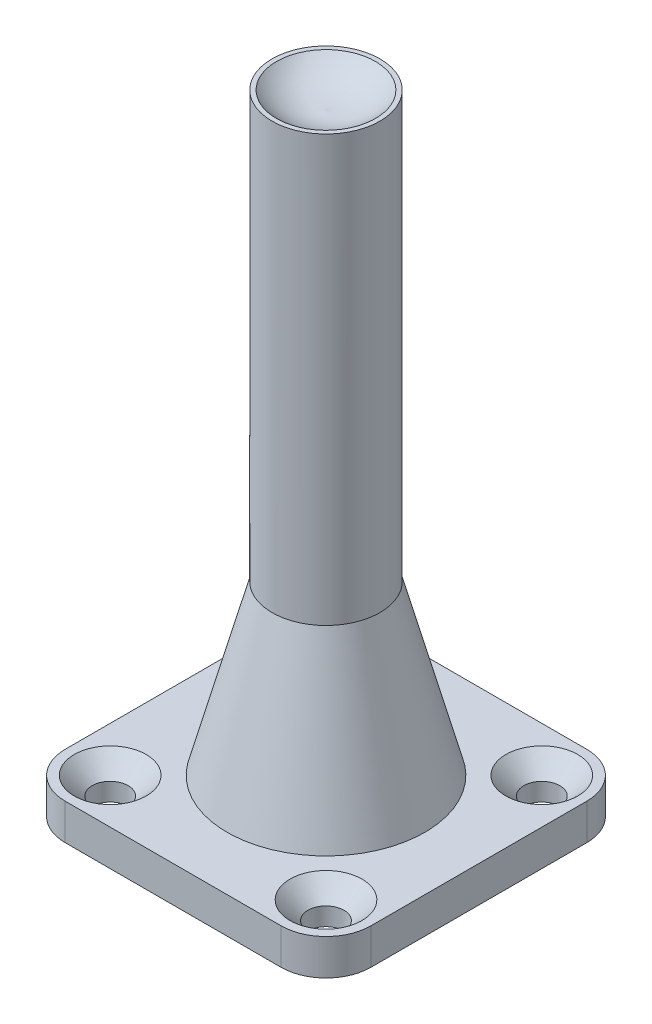
ISO-10303-21;
HEADER;
FILE_DESCRIPTION(('STEP AP214'),'2;1');
FILE_NAME('part.step','',(''),(''),'','','');
FILE_SCHEMA(('AUTOMOTIVE_DESIGN { 1 0 10303 214 1 1 1 1 }'));
ENDSEC;
DATA;
#1=APPLICATION_CONTEXT('core data for automotive mechanical design processes');
#2=APPLICATION_PROTOCOL_DEFINITION('international standard','automotive_design',2000,#1);
#3=PRODUCT_CONTEXT('',#1,'mechanical');
#4=PRODUCT('Part','Part','',(#3));
#5=PRODUCT_RELATED_PRODUCT_CATEGORY('part','',(#4));
#6=PRODUCT_DEFINITION_FORMATION('','',#4);
#7=PRODUCT_DEFINITION_CONTEXT('part definition',#1,'design');
#8=PRODUCT_DEFINITION('design','',#6,#7);
#9=PRODUCT_DEFINITION_SHAPE('','',#8);
#10=(LENGTH_UNIT() NAMED_UNIT(*) SI_UNIT(.MILLI.,.METRE.));
#11=(NAMED_UNIT(*) PLANE_ANGLE_UNIT() SI_UNIT($,.RADIAN.));
#12=(NAMED_UNIT(*) SI_UNIT($,.STERADIAN.) SOLID_ANGLE_UNIT());
#13=UNCERTAINTY_MEASURE_WITH_UNIT(LENGTH_MEASURE(1.E-05),#10,'distance_accuracy_value','');
#14=(GEOMETRIC_REPRESENTATION_CONTEXT(3) GLOBAL_UNCERTAINTY_ASSIGNED_CONTEXT((#13)) GLOBAL_UNIT_ASSIGNED_CONTEXT((#10,
#11,#12)) REPRESENTATION_CONTEXT('',''));
#15=CARTESIAN_POINT('',(0.,0.,0.));
#16=DIRECTION('',(0.,0.,1.));
#17=DIRECTION('',(1.,0.,0.));
#18=AXIS2_PLACEMENT_3D('',#15,#16,#17);
#19=CARTESIAN_POINT('',(0.,4.,0.));
#20=DIRECTION('',(0.,-1.,0.));
#21=DIRECTION('',(0.,0.,-1.));
#22=AXIS2_PLACEMENT_3D('',#19,#20,#21);
#23=PLANE('',#22);
#24=CARTESIAN_POINT('',(-12.,4.,12.));
#25=DIRECTION('',(0.,-1.,0.));
#26=DIRECTION('',(0.,0.,-1.));
#27=AXIS2_PLACEMENT_3D('',#24,#25,#26);
#28=CIRCLE('',#27,4.);
#29=CARTESIAN_POINT('',(-12.,4.,8.));
#30=VERTEX_POINT('',#29);
#31=EDGE_CURVE('E206',#30,#30,#28,.T.);
#32=ORIENTED_EDGE('',*,*,#31,.T.);
#33=EDGE_LOOP('',(#32));
#34=FACE_BOUND('',#33,.T.);
#35=CARTESIAN_POINT('',(12.,4.,12.));
#36=DIRECTION('',(0.,-1.,0.));
#37=DIRECTION('',(0.,0.,-1.));
#38=AXIS2_PLACEMENT_3D('',#35,#36,#37);
#39=CIRCLE('',#38,4.);
#40=CARTESIAN_POINT('',(12.,4.,8.));
#41=VERTEX_POINT('',#40);
#42=EDGE_CURVE('E203',#41,#41,#39,.T.);
#43=ORIENTED_EDGE('',*,*,#42,.T.);
#44=EDGE_LOOP('',(#43));
#45=FACE_BOUND('',#44,.T.);
#46=CARTESIAN_POINT('',(-12.,4.,-12.));
#47=DIRECTION('',(0.,-1.,0.));
#48=DIRECTION('',(0.,0.,-1.));
#49=AXIS2_PLACEMENT_3D('',#46,#47,#48);
#50=CIRCLE('',#49,4.);
#51=CARTESIAN_POINT('',(-12.,4.,-16.));
#52=VERTEX_POINT('',#51);
#53=EDGE_CURVE('E200',#52,#52,#50,.T.);
#54=ORIENTED_EDGE('',*,*,#53,.T.);
#55=EDGE_LOOP('',(#54));
#56=FACE_BOUND('',#55,.T.);
#57=CARTESIAN_POINT('',(12.,4.,-12.));
#58=DIRECTION('',(0.,-1.,0.));
#59=DIRECTION('',(0.,0.,-1.));
#60=AXIS2_PLACEMENT_3D('',#57,#58,#59);
#61=CIRCLE('',#60,4.);
#62=CARTESIAN_POINT('',(12.,4.,-16.));
#63=VERTEX_POINT('',#62);
#64=EDGE_CURVE('E197',#63,#63,#61,.T.);
#65=ORIENTED_EDGE('',*,*,#64,.T.);
#66=EDGE_LOOP('',(#65));
#67=FACE_BOUND('',#66,.T.);
#68=CARTESIAN_POINT('',(0.,4.,0.));
#69=DIRECTION('',(0.,-1.,0.));
#70=DIRECTION('',(0.,0.,-1.));
#71=AXIS2_PLACEMENT_3D('',#68,#69,#70);
#72=CIRCLE('',#71,11.);
#73=CARTESIAN_POINT('',(0.,4.,-11.));
#74=VERTEX_POINT('',#73);
#75=EDGE_CURVE('E191',#74,#74,#72,.T.);
#76=ORIENTED_EDGE('',*,*,#75,.T.);
#77=EDGE_LOOP('',(#76));
#78=FACE_BOUND('',#77,.T.);
#79=DIRECTION('',(1.,0.,0.));
#80=VECTOR('',#79,1.);
#81=CARTESIAN_POINT('',(-17.,4.,17.));
#82=LINE('',#81,#80);
#83=CARTESIAN_POINT('',(-12.,4.,17.));
#84=VERTEX_POINT('',#83);
#85=CARTESIAN_POINT('',(12.,4.,17.));
#86=VERTEX_POINT('',#85);
#87=EDGE_CURVE('E142',#84,#86,#82,.T.);
#88=ORIENTED_EDGE('',*,*,#87,.T.);
#89=CARTESIAN_POINT('',(12.,4.,12.));
#90=DIRECTION('',(0.,-1.,0.));
#91=DIRECTION('',(0.,0.,-1.));
#92=AXIS2_PLACEMENT_3D('',#89,#90,#91);
#93=CIRCLE('',#92,5.);
#94=CARTESIAN_POINT('',(17.,4.,12.));
#95=VERTEX_POINT('',#94);
#96=EDGE_CURVE('E177',#86,#95,#93,.F.);
#97=ORIENTED_EDGE('',*,*,#96,.T.);
#98=DIRECTION('',(0.,0.,-1.));
#99=VECTOR('',#98,1.);
#100=CARTESIAN_POINT('',(17.,4.,17.));
#101=LINE('',#100,#99);
#102=CARTESIAN_POINT('',(17.,4.,-12.));
#103=VERTEX_POINT('',#102);
#104=EDGE_CURVE('E134',#95,#103,#101,.T.);
#105=ORIENTED_EDGE('',*,*,#104,.T.);
#106=CARTESIAN_POINT('',(12.,4.,-12.));
#107=DIRECTION('',(0.,-1.,0.));
#108=DIRECTION('',(0.,0.,-1.));
#109=AXIS2_PLACEMENT_3D('',#106,#107,#108);
#110=CIRCLE('',#109,5.);
#111=CARTESIAN_POINT('',(12.,4.,-17.));
#112=VERTEX_POINT('',#111);
#113=EDGE_CURVE('E174',#103,#112,#110,.F.);
#114=ORIENTED_EDGE('',*,*,#113,.T.);
#115=DIRECTION('',(-1.,0.,0.));
#116=VECTOR('',#115,1.);
#117=CARTESIAN_POINT('',(-17.,4.,-17.));
#118=LINE('',#117,#116);
#119=CARTESIAN_POINT('',(-12.,4.,-17.));
#120=VERTEX_POINT('',#119);
#121=EDGE_CURVE('E137',#112,#120,#118,.T.);
#122=ORIENTED_EDGE('',*,*,#121,.T.);
#123=CARTESIAN_POINT('',(-12.,4.,-12.));
#124=DIRECTION('',(0.,-1.,0.));
#125=DIRECTION('',(0.,0.,-1.));
#126=AXIS2_PLACEMENT_3D('',#123,#124,#125);
#127=CIRCLE('',#126,5.);
#128=CARTESIAN_POINT('',(-17.,4.,-12.));
#129=VERTEX_POINT('',#128);
#130=EDGE_CURVE('E60',#120,#129,#127,.F.);
#131=ORIENTED_EDGE('',*,*,#130,.T.);
#132=DIRECTION('',(0.,0.,1.));
#133=VECTOR('',#132,1.);
#134=CARTESIAN_POINT('',(-17.,4.,17.));
#135=LINE('',#134,#133);
#136=CARTESIAN_POINT('',(-17.,4.,12.));
#137=VERTEX_POINT('',#136);
#138=EDGE_CURVE('E140',#129,#137,#135,.T.);
#139=ORIENTED_EDGE('',*,*,#138,.T.);
#140=CARTESIAN_POINT('',(-12.,4.,12.));
#141=DIRECTION('',(0.,-1.,0.));
#142=DIRECTION('',(0.,0.,-1.));
#143=AXIS2_PLACEMENT_3D('',#140,#141,#142);
#144=CIRCLE('',#143,5.);
#145=EDGE_CURVE('E172',#137,#84,#144,.F.);
#146=ORIENTED_EDGE('',*,*,#145,.T.);
#147=EDGE_LOOP('',(#88,#97,#105,#114,#122,#131,#139,#146));
#148=FACE_BOUND('',#147,.T.);
#149=ADVANCED_FACE('F37',(#34,#45,#56,#67,#78,#148),#23,.F.);
#150=CARTESIAN_POINT('',(0.,0.,0.));
#151=DIRECTION('',(0.,-1.,0.));
#152=DIRECTION('',(0.,0.,-1.));
#153=AXIS2_PLACEMENT_3D('',#150,#151,#152);
#154=PLANE('',#153);
#155=CARTESIAN_POINT('',(12.,0.,12.));
#156=DIRECTION('',(0.,1.,0.));
#157=DIRECTION('',(0.,0.,1.));
#158=AXIS2_PLACEMENT_3D('',#155,#156,#157);
#159=CIRCLE('',#158,2.);
#160=CARTESIAN_POINT('',(12.,0.,14.));
#161=VERTEX_POINT('',#160);
#162=EDGE_CURVE('E124',#161,#161,#159,.T.);
#163=ORIENTED_EDGE('',*,*,#162,.T.);
#164=EDGE_LOOP('',(#163));
#165=FACE_BOUND('',#164,.T.);
#166=CARTESIAN_POINT('',(-12.,0.,-12.));
#167=DIRECTION('',(0.,1.,0.));
#168=DIRECTION('',(0.,0.,1.));
#169=AXIS2_PLACEMENT_3D('',#166,#167,#168);
#170=CIRCLE('',#169,2.);
#171=CARTESIAN_POINT('',(-12.,0.,-10.));
#172=VERTEX_POINT('',#171);
#173=EDGE_CURVE('E130',#172,#172,#170,.T.);
#174=ORIENTED_EDGE('',*,*,#173,.T.);
#175=EDGE_LOOP('',(#174));
#176=FACE_BOUND('',#175,.T.);
#177=DIRECTION('',(0.,0.,-1.));
#178=VECTOR('',#177,1.);
#179=CARTESIAN_POINT('',(17.,0.,17.));
#180=LINE('',#179,#178);
#181=CARTESIAN_POINT('',(17.,0.,12.));
#182=VERTEX_POINT('',#181);
#183=CARTESIAN_POINT('',(17.,0.,-12.));
#184=VERTEX_POINT('',#183);
#185=EDGE_CURVE('E133',#182,#184,#180,.T.);
#186=ORIENTED_EDGE('',*,*,#185,.F.);
#187=CARTESIAN_POINT('',(12.,0.,12.));
#188=DIRECTION('',(0.,-1.,0.));
#189=DIRECTION('',(0.,0.,-1.));
#190=AXIS2_PLACEMENT_3D('',#187,#188,#189);
#191=CIRCLE('',#190,5.);
#192=CARTESIAN_POINT('',(12.,0.,17.));
#193=VERTEX_POINT('',#192);
#194=EDGE_CURVE('E165',#182,#193,#191,.T.);
#195=ORIENTED_EDGE('',*,*,#194,.T.);
#196=DIRECTION('',(1.,0.,0.));
#197=VECTOR('',#196,1.);
#198=CARTESIAN_POINT('',(-17.,0.,17.));
#199=LINE('',#198,#197);
#200=CARTESIAN_POINT('',(-12.,0.,17.));
#201=VERTEX_POINT('',#200);
#202=EDGE_CURVE('E138',#201,#193,#199,.T.);
#203=ORIENTED_EDGE('',*,*,#202,.F.);
#204=CARTESIAN_POINT('',(-12.,0.,12.));
#205=DIRECTION('',(0.,-1.,0.));
#206=DIRECTION('',(0.,0.,-1.));
#207=AXIS2_PLACEMENT_3D('',#204,#205,#206);
#208=CIRCLE('',#207,5.);
#209=CARTESIAN_POINT('',(-17.,0.,12.));
#210=VERTEX_POINT('',#209);
#211=EDGE_CURVE('E159',#201,#210,#208,.T.);
#212=ORIENTED_EDGE('',*,*,#211,.T.);
#213=DIRECTION('',(0.,0.,1.));
#214=VECTOR('',#213,1.);
#215=CARTESIAN_POINT('',(-17.,0.,17.));
#216=LINE('',#215,#214);
#217=CARTESIAN_POINT('',(-17.,0.,-12.));
#218=VERTEX_POINT('',#217);
#219=EDGE_CURVE('E151',#218,#210,#216,.T.);
#220=ORIENTED_EDGE('',*,*,#219,.F.);
#221=CARTESIAN_POINT('',(-12.,0.,-12.));
#222=DIRECTION('',(0.,-1.,0.));
#223=DIRECTION('',(0.,0.,-1.));
#224=AXIS2_PLACEMENT_3D('',#221,#222,#223);
#225=CIRCLE('',#224,5.);
#226=CARTESIAN_POINT('',(-12.,0.,-17.));
#227=VERTEX_POINT('',#226);
#228=EDGE_CURVE('E163',#218,#227,#225,.T.);
#229=ORIENTED_EDGE('',*,*,#228,.T.);
#230=DIRECTION('',(-1.,0.,0.));
#231=VECTOR('',#230,1.);
#232=CARTESIAN_POINT('',(-17.,0.,-17.));
#233=LINE('',#232,#231);
#234=CARTESIAN_POINT('',(12.,0.,-17.));
#235=VERTEX_POINT('',#234);
#236=EDGE_CURVE('E148',#235,#227,#233,.T.);
#237=ORIENTED_EDGE('',*,*,#236,.F.);
#238=CARTESIAN_POINT('',(12.,0.,-12.));
#239=DIRECTION('',(0.,-1.,0.));
#240=DIRECTION('',(0.,0.,-1.));
#241=AXIS2_PLACEMENT_3D('',#238,#239,#240);
#242=CIRCLE('',#241,5.);
#243=EDGE_CURVE('E161',#235,#184,#242,.T.);
#244=ORIENTED_EDGE('',*,*,#243,.T.);
#245=EDGE_LOOP('',(#186,#195,#203,#212,#220,#229,#237,#244));
#246=FACE_BOUND('',#245,.T.);
#247=CARTESIAN_POINT('',(12.,0.,-12.));
#248=DIRECTION('',(0.,1.,0.));
#249=DIRECTION('',(0.,0.,1.));
#250=AXIS2_PLACEMENT_3D('',#247,#248,#249);
#251=CIRCLE('',#250,2.);
#252=CARTESIAN_POINT('',(12.,0.,-10.));
#253=VERTEX_POINT('',#252);
#254=EDGE_CURVE('E127',#253,#253,#251,.T.);
#255=ORIENTED_EDGE('',*,*,#254,.T.);
#256=EDGE_LOOP('',(#255));
#257=FACE_BOUND('',#256,.T.);
#258=CARTESIAN_POINT('',(-12.,0.,12.));
#259=DIRECTION('',(0.,1.,0.));
#260=DIRECTION('',(0.,0.,1.));
#261=AXIS2_PLACEMENT_3D('',#258,#259,#260);
#262=CIRCLE('',#261,2.);
#263=CARTESIAN_POINT('',(-12.,0.,14.));
#264=VERTEX_POINT('',#263);
#265=EDGE_CURVE('E119',#264,#264,#262,.T.);
#266=ORIENTED_EDGE('',*,*,#265,.T.);
#267=EDGE_LOOP('',(#266));
#268=FACE_BOUND('',#267,.T.);
#269=ADVANCED_FACE('F232',(#165,#176,#246,#257,#268),#154,.T.);
#270=CARTESIAN_POINT('',(17.,4.,17.));
#271=DIRECTION('',(-1.,0.,0.));
#272=DIRECTION('',(0.,0.,1.));
#273=AXIS2_PLACEMENT_3D('',#270,#271,#272);
#274=PLANE('',#273);
#275=ORIENTED_EDGE('',*,*,#104,.F.);
#276=DIRECTION('',(0.,-1.,0.));
#277=VECTOR('',#276,1.);
#278=CARTESIAN_POINT('',(17.,4.,12.));
#279=LINE('',#278,#277);
#280=EDGE_CURVE('E156',#95,#182,#279,.T.);
#281=ORIENTED_EDGE('',*,*,#280,.T.);
#282=ORIENTED_EDGE('',*,*,#185,.T.);
#283=DIRECTION('',(0.,-1.,0.));
#284=VECTOR('',#283,1.);
#285=CARTESIAN_POINT('',(17.,4.,-12.));
#286=LINE('',#285,#284);
#287=EDGE_CURVE('E145',#184,#103,#286,.F.);
#288=ORIENTED_EDGE('',*,*,#287,.T.);
#289=EDGE_LOOP('',(#275,#281,#282,#288));
#290=FACE_BOUND('',#289,.T.);
#291=ADVANCED_FACE('F238',(#290),#274,.F.);
#292=CARTESIAN_POINT('',(-17.,4.,-17.));
#293=DIRECTION('',(0.,0.,1.));
#294=DIRECTION('',(1.,0.,0.));
#295=AXIS2_PLACEMENT_3D('',#292,#293,#294);
#296=PLANE('',#295);
#297=ORIENTED_EDGE('',*,*,#236,.T.);
#298=DIRECTION('',(0.,-1.,0.));
#299=VECTOR('',#298,1.);
#300=CARTESIAN_POINT('',(-12.,4.,-17.));
#301=LINE('',#300,#299);
#302=EDGE_CURVE('E186',#227,#120,#301,.F.);
#303=ORIENTED_EDGE('',*,*,#302,.T.);
#304=ORIENTED_EDGE('',*,*,#121,.F.);
#305=DIRECTION('',(0.,-1.,0.));
#306=VECTOR('',#305,1.);
#307=CARTESIAN_POINT('',(12.,4.,-17.));
#308=LINE('',#307,#306);
#309=EDGE_CURVE('E183',#112,#235,#308,.T.);
#310=ORIENTED_EDGE('',*,*,#309,.T.);
#311=EDGE_LOOP('',(#297,#303,#304,#310));
#312=FACE_BOUND('',#311,.T.);
#313=ADVANCED_FACE('F252',(#312),#296,.F.);
#314=CARTESIAN_POINT('',(-17.,4.,17.));
#315=DIRECTION('',(1.,0.,0.));
#316=DIRECTION('',(0.,0.,-1.));
#317=AXIS2_PLACEMENT_3D('',#314,#315,#316);
#318=PLANE('',#317);
#319=ORIENTED_EDGE('',*,*,#138,.F.);
#320=DIRECTION('',(0.,-1.,0.));
#321=VECTOR('',#320,1.);
#322=CARTESIAN_POINT('',(-17.,4.,-12.));
#323=LINE('',#322,#321);
#324=EDGE_CURVE('E180',#129,#218,#323,.T.);
#325=ORIENTED_EDGE('',*,*,#324,.T.);
#326=ORIENTED_EDGE('',*,*,#219,.T.);
#327=DIRECTION('',(0.,-1.,0.));
#328=VECTOR('',#327,1.);
#329=CARTESIAN_POINT('',(-17.,4.,12.));
#330=LINE('',#329,#328);
#331=EDGE_CURVE('E53',#210,#137,#330,.F.);
#332=ORIENTED_EDGE('',*,*,#331,.T.);
#333=EDGE_LOOP('',(#319,#325,#326,#332));
#334=FACE_BOUND('',#333,.T.);
#335=ADVANCED_FACE('F248',(#334),#318,.F.);
#336=CARTESIAN_POINT('',(-17.,4.,17.));
#337=DIRECTION('',(0.,0.,-1.));
#338=DIRECTION('',(-1.,0.,0.));
#339=AXIS2_PLACEMENT_3D('',#336,#337,#338);
#340=PLANE('',#339);
#341=ORIENTED_EDGE('',*,*,#202,.T.);
#342=DIRECTION('',(0.,-1.,0.));
#343=VECTOR('',#342,1.);
#344=CARTESIAN_POINT('',(12.,4.,17.));
#345=LINE('',#344,#343);
#346=EDGE_CURVE('E170',#193,#86,#345,.F.);
#347=ORIENTED_EDGE('',*,*,#346,.T.);
#348=ORIENTED_EDGE('',*,*,#87,.F.);
#349=DIRECTION('',(0.,-1.,0.));
#350=VECTOR('',#349,1.);
#351=CARTESIAN_POINT('',(-12.,4.,17.));
#352=LINE('',#351,#350);
#353=EDGE_CURVE('E167',#84,#201,#352,.T.);
#354=ORIENTED_EDGE('',*,*,#353,.T.);
#355=EDGE_LOOP('',(#341,#347,#348,#354));
#356=FACE_BOUND('',#355,.T.);
#357=ADVANCED_FACE('F245',(#356),#340,.F.);
#358=CARTESIAN_POINT('',(-12.,4.,-12.));
#359=DIRECTION('',(0.,-1.,0.));
#360=DIRECTION('',(0.,0.,-1.));
#361=AXIS2_PLACEMENT_3D('',#358,#359,#360);
#362=CYLINDRICAL_SURFACE('',#361,2.);
#363=CARTESIAN_POINT('',(-12.,2.00000000000001,-12.));
#364=DIRECTION('',(0.,-1.,0.));
#365=DIRECTION('',(0.,0.,-1.));
#366=AXIS2_PLACEMENT_3D('',#363,#364,#365);
#367=CIRCLE('',#366,2.);
#368=CARTESIAN_POINT('',(-12.,2.00000000000001,-14.));
#369=VERTEX_POINT('',#368);
#370=EDGE_CURVE('E46',#369,#369,#367,.F.);
#371=ORIENTED_EDGE('',*,*,#370,.T.);
#372=EDGE_LOOP('',(#371));
#373=FACE_BOUND('',#372,.T.);
#374=ORIENTED_EDGE('',*,*,#173,.F.);
#375=EDGE_LOOP('',(#374));
#376=FACE_BOUND('',#375,.T.);
#377=ADVANCED_FACE('F214',(#373,#376),#362,.F.);
#378=CARTESIAN_POINT('',(12.,4.,-12.));
#379=DIRECTION('',(0.,-1.,0.));
#380=DIRECTION('',(0.,0.,-1.));
#381=AXIS2_PLACEMENT_3D('',#378,#379,#380);
#382=CYLINDRICAL_SURFACE('',#381,2.);
#383=CARTESIAN_POINT('',(12.,2.00000000000001,-12.));
#384=DIRECTION('',(0.,-1.,0.));
#385=DIRECTION('',(0.,0.,-1.));
#386=AXIS2_PLACEMENT_3D('',#383,#384,#385);
#387=CIRCLE('',#386,2.);
#388=CARTESIAN_POINT('',(12.,2.00000000000001,-14.));
#389=VERTEX_POINT('',#388);
#390=EDGE_CURVE('E11',#389,#389,#387,.F.);
#391=ORIENTED_EDGE('',*,*,#390,.T.);
#392=EDGE_LOOP('',(#391));
#393=FACE_BOUND('',#392,.T.);
#394=ORIENTED_EDGE('',*,*,#254,.F.);
#395=EDGE_LOOP('',(#394));
#396=FACE_BOUND('',#395,.T.);
#397=ADVANCED_FACE('F310',(#393,#396),#382,.F.);
#398=CARTESIAN_POINT('',(12.,4.,12.));
#399=DIRECTION('',(0.,-1.,0.));
#400=DIRECTION('',(0.,0.,-1.));
#401=AXIS2_PLACEMENT_3D('',#398,#399,#400);
#402=CYLINDRICAL_SURFACE('',#401,2.);
#403=CARTESIAN_POINT('',(12.,2.00000000000001,12.));
#404=DIRECTION('',(0.,-1.,0.));
#405=DIRECTION('',(0.,0.,-1.));
#406=AXIS2_PLACEMENT_3D('',#403,#404,#405);
#407=CIRCLE('',#406,2.);
#408=CARTESIAN_POINT('',(12.,2.00000000000001,10.));
#409=VERTEX_POINT('',#408);
#410=EDGE_CURVE('E209',#409,#409,#407,.F.);
#411=ORIENTED_EDGE('',*,*,#410,.T.);
#412=EDGE_LOOP('',(#411));
#413=FACE_BOUND('',#412,.T.);
#414=ORIENTED_EDGE('',*,*,#162,.F.);
#415=EDGE_LOOP('',(#414));
#416=FACE_BOUND('',#415,.T.);
#417=ADVANCED_FACE('F303',(#413,#416),#402,.F.);
#418=CARTESIAN_POINT('',(-12.,4.,12.));
#419=DIRECTION('',(0.,-1.,0.));
#420=DIRECTION('',(0.,0.,-1.));
#421=AXIS2_PLACEMENT_3D('',#418,#419,#420);
#422=CYLINDRICAL_SURFACE('',#421,2.);
#423=CARTESIAN_POINT('',(-12.,2.00000000000001,12.));
#424=DIRECTION('',(0.,-1.,0.));
#425=DIRECTION('',(0.,0.,-1.));
#426=AXIS2_PLACEMENT_3D('',#423,#424,#425);
#427=CIRCLE('',#426,2.);
#428=CARTESIAN_POINT('',(-12.,2.00000000000001,10.));
#429=VERTEX_POINT('',#428);
#430=EDGE_CURVE('E194',#429,#429,#427,.F.);
#431=ORIENTED_EDGE('',*,*,#430,.T.);
#432=EDGE_LOOP('',(#431));
#433=FACE_BOUND('',#432,.T.);
#434=ORIENTED_EDGE('',*,*,#265,.F.);
#435=EDGE_LOOP('',(#434));
#436=FACE_BOUND('',#435,.T.);
#437=ADVANCED_FACE('F263',(#433,#436),#422,.F.);
#438=CARTESIAN_POINT('',(12.,4.,12.));
#439=DIRECTION('',(0.,-1.,0.));
#440=DIRECTION('',(0.,0.,-1.));
#441=AXIS2_PLACEMENT_3D('',#438,#439,#440);
#442=CYLINDRICAL_SURFACE('',#441,5.);
#443=ORIENTED_EDGE('',*,*,#96,.F.);
#444=ORIENTED_EDGE('',*,*,#346,.F.);
#445=ORIENTED_EDGE('',*,*,#194,.F.);
#446=ORIENTED_EDGE('',*,*,#280,.F.);
#447=EDGE_LOOP('',(#443,#444,#445,#446));
#448=FACE_BOUND('',#447,.T.);
#449=ADVANCED_FACE('F259',(#448),#442,.T.);
#450=CARTESIAN_POINT('',(-12.,4.,-12.));
#451=DIRECTION('',(0.,-1.,0.));
#452=DIRECTION('',(0.,0.,-1.));
#453=AXIS2_PLACEMENT_3D('',#450,#451,#452);
#454=CYLINDRICAL_SURFACE('',#453,5.);
#455=ORIENTED_EDGE('',*,*,#130,.F.);
#456=ORIENTED_EDGE('',*,*,#302,.F.);
#457=ORIENTED_EDGE('',*,*,#228,.F.);
#458=ORIENTED_EDGE('',*,*,#324,.F.);
#459=EDGE_LOOP('',(#455,#456,#457,#458));
#460=FACE_BOUND('',#459,.T.);
#461=ADVANCED_FACE('F262',(#460),#454,.T.);
#462=CARTESIAN_POINT('',(12.,4.,-12.));
#463=DIRECTION('',(0.,-1.,0.));
#464=DIRECTION('',(0.,0.,-1.));
#465=AXIS2_PLACEMENT_3D('',#462,#463,#464);
#466=CYLINDRICAL_SURFACE('',#465,5.);
#467=ORIENTED_EDGE('',*,*,#113,.F.);
#468=ORIENTED_EDGE('',*,*,#287,.F.);
#469=ORIENTED_EDGE('',*,*,#243,.F.);
#470=ORIENTED_EDGE('',*,*,#309,.F.);
#471=EDGE_LOOP('',(#467,#468,#469,#470));
#472=FACE_BOUND('',#471,.T.);
#473=ADVANCED_FACE('F267',(#472),#466,.T.);
#474=CARTESIAN_POINT('',(-12.,4.,12.));
#475=DIRECTION('',(0.,-1.,0.));
#476=DIRECTION('',(0.,0.,-1.));
#477=AXIS2_PLACEMENT_3D('',#474,#475,#476);
#478=CYLINDRICAL_SURFACE('',#477,5.);
#479=ORIENTED_EDGE('',*,*,#145,.F.);
#480=ORIENTED_EDGE('',*,*,#331,.F.);
#481=ORIENTED_EDGE('',*,*,#211,.F.);
#482=ORIENTED_EDGE('',*,*,#353,.F.);
#483=EDGE_LOOP('',(#479,#480,#481,#482));
#484=FACE_BOUND('',#483,.T.);
#485=ADVANCED_FACE('F271',(#484),#478,.T.);
#486=CARTESIAN_POINT('',(0.,70.,0.));
#487=DIRECTION('',(0.,-1.,0.));
#488=DIRECTION('',(0.,0.,-1.));
#489=AXIS2_PLACEMENT_3D('',#486,#487,#488);
#490=CYLINDRICAL_SURFACE('',#489,6.);
#491=CARTESIAN_POINT('',(0.,22.660254037845,0.));
#492=DIRECTION('',(0.,-1.,0.));
#493=DIRECTION('',(0.,0.,-1.));
#494=AXIS2_PLACEMENT_3D('',#491,#492,#493);
#495=CIRCLE('',#494,6.);
#496=CARTESIAN_POINT('',(0.,22.660254037845,-6.));
#497=VERTEX_POINT('',#496);
#498=EDGE_CURVE('E188',#497,#497,#495,.F.);
#499=ORIENTED_EDGE('',*,*,#498,.T.);
#500=EDGE_LOOP('',(#499));
#501=FACE_BOUND('',#500,.T.);
#502=CARTESIAN_POINT('',(0.,70.,0.));
#503=DIRECTION('',(0.,1.,0.));
#504=DIRECTION('',(0.,0.,1.));
#505=AXIS2_PLACEMENT_3D('',#502,#503,#504);
#506=CIRCLE('',#505,6.);
#507=CARTESIAN_POINT('',(0.,70.,6.));
#508=VERTEX_POINT('',#507);
#509=EDGE_CURVE('E116',#508,#508,#506,.T.);
#510=ORIENTED_EDGE('',*,*,#509,.F.);
#511=EDGE_LOOP('',(#510));
#512=FACE_BOUND('',#511,.T.);
#513=ADVANCED_FACE('F275',(#501,#512),#490,.T.);
#514=CARTESIAN_POINT('',(0.,70.,0.));
#515=DIRECTION('',(0.,1.,0.));
#516=DIRECTION('',(0.,0.,1.));
#517=AXIS2_PLACEMENT_3D('',#514,#515,#516);
#518=PLANE('',#517);
#519=CARTESIAN_POINT('',(0.,70.,0.));
#520=DIRECTION('',(0.,1.,0.));
#521=DIRECTION('',(-1.,0.,0.));
#522=AXIS2_PLACEMENT_3D('',#519,#520,#521);
#523=CIRCLE('',#522,5.5);
#524=CARTESIAN_POINT('',(-5.5,70.,0.));
#525=VERTEX_POINT('',#524);
#526=EDGE_CURVE('E114',#525,#525,#523,.T.);
#527=ORIENTED_EDGE('',*,*,#526,.F.);
#528=EDGE_LOOP('',(#527));
#529=FACE_BOUND('',#528,.T.);
#530=ORIENTED_EDGE('',*,*,#509,.T.);
#531=EDGE_LOOP('',(#530));
#532=FACE_BOUND('',#531,.T.);
#533=ADVANCED_FACE('F110',(#529,#532),#518,.T.);
#534=CARTESIAN_POINT('',(-0.685459934313938,74.6774851806367,0.));
#535=DIRECTION('',(0.,0.,-1.));
#536=DIRECTION('',(-1.,0.,0.));
#537=AXIS2_PLACEMENT_3D('',#534,#535,#536);
#538=CIRCLE('',#537,6.71257503936994);
#539=TRIMMED_CURVE('',#538,(PARAMETER_VALUE(-1.67309043047333)),
(PARAMETER_VALUE(1.67309043047333)),.T.,.PARAMETER.);
#540=CARTESIAN_POINT('',(0.,74.6774851806367,0.));
#541=DIRECTION('',(0.,1.,0.));
#542=AXIS1_PLACEMENT('',#540,#541);
#543=SURFACE_OF_REVOLUTION('',#539,#542);
#544=CARTESIAN_POINT('',(0.,68.,0.));
#545=VERTEX_POINT('',#544);
#546=VERTEX_LOOP('',#545);
#547=FACE_BOUND('',#546,.T.);
#548=ORIENTED_EDGE('',*,*,#526,.T.);
#549=EDGE_LOOP('',(#548));
#550=FACE_BOUND('',#549,.T.);
#551=ADVANCED_FACE('F106',(#547,#550),#543,.F.);
#552=CARTESIAN_POINT('',(0.,22.660254037845,0.));
#553=DIRECTION('',(0.,-1.,0.));
#554=DIRECTION('',(0.,0.,-1.));
#555=AXIS2_PLACEMENT_3D('',#552,#553,#554);
#556=CONICAL_SURFACE('',#555,6.,0.261799387799143);
#557=ORIENTED_EDGE('',*,*,#75,.F.);
#558=EDGE_LOOP('',(#557));
#559=FACE_BOUND('',#558,.T.);
#560=ORIENTED_EDGE('',*,*,#498,.F.);
#561=EDGE_LOOP('',(#560));
#562=FACE_BOUND('',#561,.T.);
#563=ADVANCED_FACE('F109',(#559,#562),#556,.T.);
#564=CARTESIAN_POINT('',(-12.,2.00000000000001,12.));
#565=DIRECTION('',(0.,1.,0.));
#566=DIRECTION('',(0.,0.,1.));
#567=AXIS2_PLACEMENT_3D('',#564,#565,#566);
#568=CONICAL_SURFACE('',#567,2.,0.78539816339745);
#569=ORIENTED_EDGE('',*,*,#31,.F.);
#570=EDGE_LOOP('',(#569));
#571=FACE_BOUND('',#570,.T.);
#572=ORIENTED_EDGE('',*,*,#430,.F.);
#573=EDGE_LOOP('',(#572));
#574=FACE_BOUND('',#573,.T.);
#575=ADVANCED_FACE('F226',(#571,#574),#568,.F.);
#576=CARTESIAN_POINT('',(12.,2.00000000000001,12.));
#577=DIRECTION('',(0.,1.,0.));
#578=DIRECTION('',(0.,0.,1.));
#579=AXIS2_PLACEMENT_3D('',#576,#577,#578);
#580=CONICAL_SURFACE('',#579,2.,0.78539816339745);
#581=ORIENTED_EDGE('',*,*,#42,.F.);
#582=EDGE_LOOP('',(#581));
#583=FACE_BOUND('',#582,.T.);
#584=ORIENTED_EDGE('',*,*,#410,.F.);
#585=EDGE_LOOP('',(#584));
#586=FACE_BOUND('',#585,.T.);
#587=ADVANCED_FACE('F219',(#583,#586),#580,.F.);
#588=CARTESIAN_POINT('',(-12.,2.00000000000001,-12.));
#589=DIRECTION('',(0.,1.,0.));
#590=DIRECTION('',(0.,0.,1.));
#591=AXIS2_PLACEMENT_3D('',#588,#589,#590);
#592=CONICAL_SURFACE('',#591,2.,0.78539816339745);
#593=ORIENTED_EDGE('',*,*,#53,.F.);
#594=EDGE_LOOP('',(#593));
#595=FACE_BOUND('',#594,.T.);
#596=ORIENTED_EDGE('',*,*,#370,.F.);
#597=EDGE_LOOP('',(#596));
#598=FACE_BOUND('',#597,.T.);
#599=ADVANCED_FACE('F217',(#595,#598),#592,.F.);
#600=CARTESIAN_POINT('',(12.,2.00000000000001,-12.));
#601=DIRECTION('',(0.,1.,0.));
#602=DIRECTION('',(0.,0.,1.));
#603=AXIS2_PLACEMENT_3D('',#600,#601,#602);
#604=CONICAL_SURFACE('',#603,2.,0.78539816339745);
#605=ORIENTED_EDGE('',*,*,#64,.F.);
#606=EDGE_LOOP('',(#605));
#607=FACE_BOUND('',#606,.T.);
#608=ORIENTED_EDGE('',*,*,#390,.F.);
#609=EDGE_LOOP('',(#608));
#610=FACE_BOUND('',#609,.T.);
#611=ADVANCED_FACE('F40',(#607,#610),#604,.F.);
#612=CLOSED_SHELL('',(#149,#269,#291,#313,#335,#357,#377,#397,#417,#437,#449,#461,#473,#485,
#513,#533,#551,#563,#575,#587,#599,#611));
#613=MANIFOLD_SOLID_BREP('B2',#612);
#614=ADVANCED_BREP_SHAPE_REPRESENTATION('',(#18,#613),#14);
#615=SHAPE_DEFINITION_REPRESENTATION(#9,#614);
ENDSEC;
END-ISO-10303-21;
